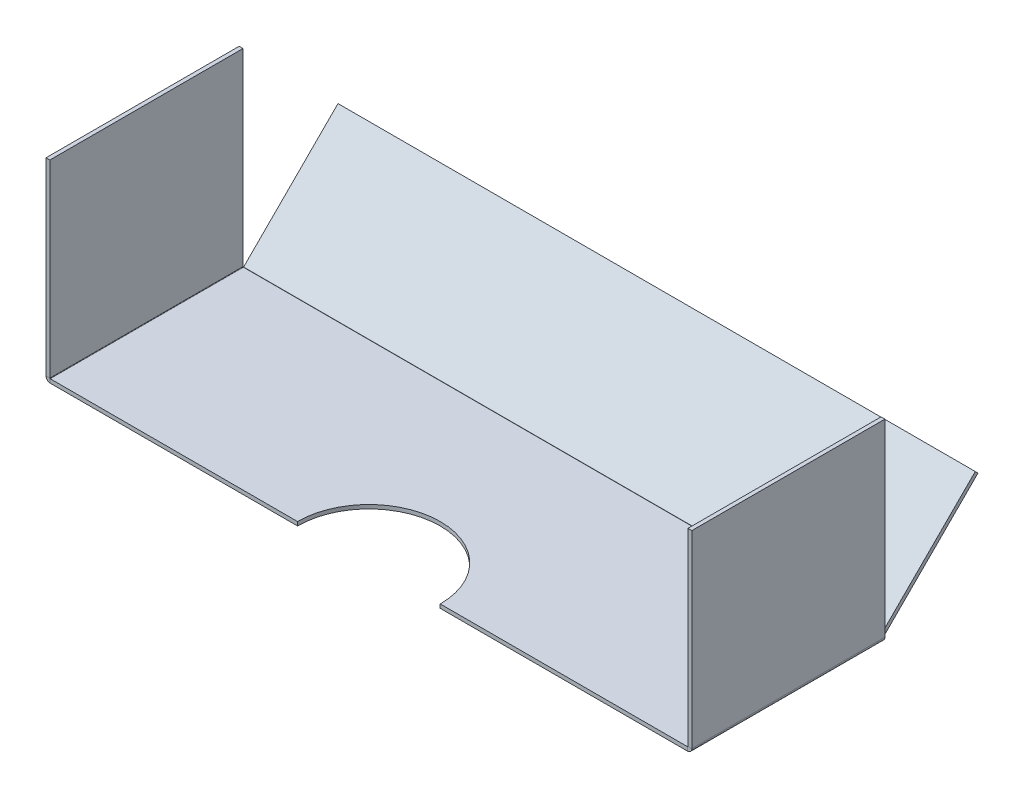
ISO-10303-21;
HEADER;
FILE_DESCRIPTION(('STEP AP214'),'2;1');
FILE_NAME('part.step','',(''),(''),'','','');
FILE_SCHEMA(('AUTOMOTIVE_DESIGN { 1 0 10303 214 1 1 1 1 }'));
ENDSEC;
DATA;
#1=APPLICATION_CONTEXT('core data for automotive mechanical design processes');
#2=APPLICATION_PROTOCOL_DEFINITION('international standard','automotive_design',2000,#1);
#3=PRODUCT_CONTEXT('',#1,'mechanical');
#4=PRODUCT('Part','Part','',(#3));
#5=PRODUCT_RELATED_PRODUCT_CATEGORY('part','',(#4));
#6=PRODUCT_DEFINITION_FORMATION('','',#4);
#7=PRODUCT_DEFINITION_CONTEXT('part definition',#1,'design');
#8=PRODUCT_DEFINITION('design','',#6,#7);
#9=PRODUCT_DEFINITION_SHAPE('','',#8);
#10=(LENGTH_UNIT() NAMED_UNIT(*) SI_UNIT(.MILLI.,.METRE.));
#11=(NAMED_UNIT(*) PLANE_ANGLE_UNIT() SI_UNIT($,.RADIAN.));
#12=(NAMED_UNIT(*) SI_UNIT($,.STERADIAN.) SOLID_ANGLE_UNIT());
#13=UNCERTAINTY_MEASURE_WITH_UNIT(LENGTH_MEASURE(1.E-05),#10,'distance_accuracy_value','');
#14=(GEOMETRIC_REPRESENTATION_CONTEXT(3) GLOBAL_UNCERTAINTY_ASSIGNED_CONTEXT((#13)) GLOBAL_UNIT_ASSIGNED_CONTEXT((#10,
#11,#12)) REPRESENTATION_CONTEXT('',''));
#15=CARTESIAN_POINT('',(0.,0.,0.));
#16=DIRECTION('',(0.,0.,1.));
#17=DIRECTION('',(1.,0.,0.));
#18=AXIS2_PLACEMENT_3D('',#15,#16,#17);
#19=CARTESIAN_POINT('',(-82.5,-1.,25.));
#20=DIRECTION('',(0.,0.,1.));
#21=DIRECTION('',(1.,0.,0.));
#22=AXIS2_PLACEMENT_3D('',#19,#20,#21);
#23=PLANE('',#22);
#24=DIRECTION('',(0.,1.,0.));
#25=VECTOR('',#24,1.);
#26=CARTESIAN_POINT('',(18.4747200460575,-10.,25.));
#27=LINE('',#26,#25);
#28=CARTESIAN_POINT('',(18.4747200460575,-0.999999999999999,25.));
#29=VERTEX_POINT('',#28);
#30=CARTESIAN_POINT('',(18.4747200460575,0.,25.));
#31=VERTEX_POINT('',#30);
#32=EDGE_CURVE('E115',#29,#31,#27,.T.);
#33=ORIENTED_EDGE('',*,*,#32,.F.);
#34=DIRECTION('',(1.,0.,0.));
#35=VECTOR('',#34,1.);
#36=CARTESIAN_POINT('',(-82.5,-1.,25.));
#37=LINE('',#36,#35);
#38=CARTESIAN_POINT('',(82.5,-1.,25.));
#39=VERTEX_POINT('',#38);
#40=EDGE_CURVE('E122',#29,#39,#37,.T.);
#41=ORIENTED_EDGE('',*,*,#40,.T.);
#42=DIRECTION('',(0.,1.,0.));
#43=VECTOR('',#42,1.);
#44=CARTESIAN_POINT('',(82.5,-1.,25.));
#45=LINE('',#44,#43);
#46=CARTESIAN_POINT('',(82.5,0.,25.));
#47=VERTEX_POINT('',#46);
#48=EDGE_CURVE('E13',#39,#47,#45,.T.);
#49=ORIENTED_EDGE('',*,*,#48,.T.);
#50=DIRECTION('',(1.,0.,0.));
#51=VECTOR('',#50,1.);
#52=CARTESIAN_POINT('',(-82.5,0.,25.));
#53=LINE('',#52,#51);
#54=EDGE_CURVE('E152',#31,#47,#53,.T.);
#55=ORIENTED_EDGE('',*,*,#54,.F.);
#56=EDGE_LOOP('',(#33,#41,#49,#55));
#57=FACE_BOUND('',#56,.T.);
#58=ADVANCED_FACE('F98',(#57),#23,.T.);
#59=DIRECTION('',(0.,1.,0.));
#60=VECTOR('',#59,1.);
#61=CARTESIAN_POINT('',(-18.4747200460575,-10.,25.));
#62=LINE('',#61,#60);
#63=CARTESIAN_POINT('',(-18.4747200460575,0.,25.));
#64=VERTEX_POINT('',#63);
#65=CARTESIAN_POINT('',(-18.4747200460575,-0.999999999999999,25.));
#66=VERTEX_POINT('',#65);
#67=EDGE_CURVE('E161',#64,#66,#62,.F.);
#68=ORIENTED_EDGE('',*,*,#67,.F.);
#69=CARTESIAN_POINT('',(-82.5,0.,25.));
#70=VERTEX_POINT('',#69);
#71=EDGE_CURVE('E145',#70,#64,#53,.T.);
#72=ORIENTED_EDGE('',*,*,#71,.F.);
#73=DIRECTION('',(0.,1.,0.));
#74=VECTOR('',#73,1.);
#75=CARTESIAN_POINT('',(-82.5,-1.,25.));
#76=LINE('',#75,#74);
#77=CARTESIAN_POINT('',(-82.5,-1.,25.));
#78=VERTEX_POINT('',#77);
#79=EDGE_CURVE('E107',#78,#70,#76,.T.);
#80=ORIENTED_EDGE('',*,*,#79,.F.);
#81=EDGE_CURVE('E195',#78,#66,#37,.T.);
#82=ORIENTED_EDGE('',*,*,#81,.T.);
#83=EDGE_LOOP('',(#68,#72,#80,#82));
#84=FACE_BOUND('',#83,.T.);
#85=ADVANCED_FACE('F100',(#84),#23,.T.);
#86=CARTESIAN_POINT('',(0.,-1.,0.));
#87=DIRECTION('',(0.,1.,0.));
#88=DIRECTION('',(0.,0.,1.));
#89=AXIS2_PLACEMENT_3D('',#86,#87,#88);
#90=PLANE('',#89);
#91=ORIENTED_EDGE('',*,*,#40,.F.);
#92=CARTESIAN_POINT('',(0.,-0.999999999999999,25.));
#93=DIRECTION('',(0.,1.,0.));
#94=DIRECTION('',(0.,0.,1.));
#95=AXIS2_PLACEMENT_3D('',#92,#93,#94);
#96=CIRCLE('',#95,18.4747200460575);
#97=EDGE_CURVE('E257',#29,#66,#96,.T.);
#98=ORIENTED_EDGE('',*,*,#97,.T.);
#99=ORIENTED_EDGE('',*,*,#81,.F.);
#100=DIRECTION('',(0.,0.,1.));
#101=VECTOR('',#100,1.);
#102=CARTESIAN_POINT('',(-82.5,-1.,-25.));
#103=LINE('',#102,#101);
#104=CARTESIAN_POINT('',(-82.5,-0.999999999999999,-25.));
#105=VERTEX_POINT('',#104);
#106=EDGE_CURVE('E193',#105,#78,#103,.T.);
#107=ORIENTED_EDGE('',*,*,#106,.F.);
#108=DIRECTION('',(-1.,0.,0.));
#109=VECTOR('',#108,1.);
#110=CARTESIAN_POINT('',(-82.5,-1.,-25.));
#111=LINE('',#110,#109);
#112=CARTESIAN_POINT('',(82.5,-1.,-25.));
#113=VERTEX_POINT('',#112);
#114=EDGE_CURVE('E190',#113,#105,#111,.T.);
#115=ORIENTED_EDGE('',*,*,#114,.F.);
#116=DIRECTION('',(0.,0.,-1.));
#117=VECTOR('',#116,1.);
#118=CARTESIAN_POINT('',(82.5,-1.,-25.));
#119=LINE('',#118,#117);
#120=EDGE_CURVE('E162',#39,#113,#119,.T.);
#121=ORIENTED_EDGE('',*,*,#120,.F.);
#122=EDGE_LOOP('',(#91,#98,#99,#107,#115,#121));
#123=FACE_BOUND('',#122,.T.);
#124=ADVANCED_FACE('F476',(#123),#90,.F.);
#125=CARTESIAN_POINT('',(0.,0.,0.));
#126=DIRECTION('',(0.,1.,0.));
#127=DIRECTION('',(0.,0.,1.));
#128=AXIS2_PLACEMENT_3D('',#125,#126,#127);
#129=PLANE('',#128);
#130=CARTESIAN_POINT('',(0.,0.,25.));
#131=DIRECTION('',(0.,1.,0.));
#132=DIRECTION('',(0.,0.,1.));
#133=AXIS2_PLACEMENT_3D('',#130,#131,#132);
#134=CIRCLE('',#133,18.4747200460575);
#135=EDGE_CURVE('E255',#31,#64,#134,.T.);
#136=ORIENTED_EDGE('',*,*,#135,.F.);
#137=ORIENTED_EDGE('',*,*,#54,.T.);
#138=DIRECTION('',(0.,0.,-1.));
#139=VECTOR('',#138,1.);
#140=CARTESIAN_POINT('',(82.5,0.,-25.));
#141=LINE('',#140,#139);
#142=CARTESIAN_POINT('',(82.5,0.,-25.));
#143=VERTEX_POINT('',#142);
#144=EDGE_CURVE('E197',#47,#143,#141,.T.);
#145=ORIENTED_EDGE('',*,*,#144,.T.);
#146=DIRECTION('',(-1.,0.,0.));
#147=VECTOR('',#146,1.);
#148=CARTESIAN_POINT('',(-82.5,0.,-25.));
#149=LINE('',#148,#147);
#150=CARTESIAN_POINT('',(-82.5,0.,-25.));
#151=VERTEX_POINT('',#150);
#152=EDGE_CURVE('E147',#143,#151,#149,.T.);
#153=ORIENTED_EDGE('',*,*,#152,.T.);
#154=DIRECTION('',(0.,0.,1.));
#155=VECTOR('',#154,1.);
#156=CARTESIAN_POINT('',(-82.5,0.,-25.));
#157=LINE('',#156,#155);
#158=EDGE_CURVE('E141',#151,#70,#157,.T.);
#159=ORIENTED_EDGE('',*,*,#158,.T.);
#160=ORIENTED_EDGE('',*,*,#71,.T.);
#161=EDGE_LOOP('',(#136,#137,#145,#153,#159,#160));
#162=FACE_BOUND('',#161,.T.);
#163=ADVANCED_FACE('F143',(#162),#129,.T.);
#164=CARTESIAN_POINT('',(-82.5,0.100000000000003,-25.));
#165=DIRECTION('',(0.,0.,-1.));
#166=DIRECTION('',(-1.,0.,0.));
#167=AXIS2_PLACEMENT_3D('',#164,#165,#166);
#168=PLANE('',#167);
#169=DIRECTION('',(1.,0.,0.));
#170=VECTOR('',#169,1.);
#171=CARTESIAN_POINT('',(-83.6,0.0999999999999995,-25.));
#172=LINE('',#171,#170);
#173=CARTESIAN_POINT('',(-82.6,0.100000000000003,-25.));
#174=VERTEX_POINT('',#173);
#175=CARTESIAN_POINT('',(-83.6,0.0999999999999995,-25.));
#176=VERTEX_POINT('',#175);
#177=EDGE_CURVE('E297',#174,#176,#172,.F.);
#178=ORIENTED_EDGE('',*,*,#177,.F.);
#179=CARTESIAN_POINT('',(-82.5,0.100000000000003,-25.));
#180=DIRECTION('',(0.,0.,1.));
#181=DIRECTION('',(1.,0.,0.));
#182=AXIS2_PLACEMENT_3D('',#179,#180,#181);
#183=CIRCLE('',#182,0.100000000000003);
#184=EDGE_CURVE('E179',#151,#174,#183,.F.);
#185=ORIENTED_EDGE('',*,*,#184,.F.);
#186=DIRECTION('',(0.,1.,0.));
#187=VECTOR('',#186,1.);
#188=CARTESIAN_POINT('',(-82.5,-1.,-25.));
#189=LINE('',#188,#187);
#190=EDGE_CURVE('E173',#105,#151,#189,.T.);
#191=ORIENTED_EDGE('',*,*,#190,.F.);
#192=CARTESIAN_POINT('',(-82.5,0.100000000000003,-25.));
#193=DIRECTION('',(0.,0.,1.));
#194=DIRECTION('',(1.,0.,0.));
#195=AXIS2_PLACEMENT_3D('',#192,#193,#194);
#196=CIRCLE('',#195,1.1);
#197=EDGE_CURVE('E199',#105,#176,#196,.F.);
#198=ORIENTED_EDGE('',*,*,#197,.T.);
#199=EDGE_LOOP('',(#178,#185,#191,#198));
#200=FACE_BOUND('',#199,.T.);
#201=ADVANCED_FACE('F333',(#200),#168,.T.);
#202=CARTESIAN_POINT('',(-82.5,0.100000000000003,25.));
#203=DIRECTION('',(0.,0.,-1.));
#204=DIRECTION('',(-1.,0.,0.));
#205=AXIS2_PLACEMENT_3D('',#202,#203,#204);
#206=PLANE('',#205);
#207=CARTESIAN_POINT('',(-82.5,0.100000000000003,25.));
#208=DIRECTION('',(0.,0.,1.));
#209=DIRECTION('',(1.,0.,0.));
#210=AXIS2_PLACEMENT_3D('',#207,#208,#209);
#211=CIRCLE('',#210,0.100000000000003);
#212=CARTESIAN_POINT('',(-82.6,0.100000000000003,25.));
#213=VERTEX_POINT('',#212);
#214=EDGE_CURVE('E169',#213,#70,#211,.T.);
#215=ORIENTED_EDGE('',*,*,#214,.F.);
#216=DIRECTION('',(1.,0.,0.));
#217=VECTOR('',#216,1.);
#218=CARTESIAN_POINT('',(-82.6,0.100000000000003,25.));
#219=LINE('',#218,#217);
#220=CARTESIAN_POINT('',(-83.6,0.0999999999999995,25.));
#221=VERTEX_POINT('',#220);
#222=EDGE_CURVE('E323',#213,#221,#219,.F.);
#223=ORIENTED_EDGE('',*,*,#222,.T.);
#224=CARTESIAN_POINT('',(-82.5,0.100000000000003,25.));
#225=DIRECTION('',(0.,0.,1.));
#226=DIRECTION('',(1.,0.,0.));
#227=AXIS2_PLACEMENT_3D('',#224,#225,#226);
#228=CIRCLE('',#227,1.1);
#229=EDGE_CURVE('E172',#221,#78,#228,.T.);
#230=ORIENTED_EDGE('',*,*,#229,.T.);
#231=ORIENTED_EDGE('',*,*,#79,.T.);
#232=EDGE_LOOP('',(#215,#223,#230,#231));
#233=FACE_BOUND('',#232,.T.);
#234=ADVANCED_FACE('F167',(#233),#206,.F.);
#235=CARTESIAN_POINT('',(-82.5,0.100000000000003,25.));
#236=DIRECTION('',(0.,0.,1.));
#237=DIRECTION('',(-1.,0.,0.));
#238=AXIS2_PLACEMENT_3D('',#235,#236,#237);
#239=CYLINDRICAL_SURFACE('',#238,1.1);
#240=ORIENTED_EDGE('',*,*,#106,.T.);
#241=ORIENTED_EDGE('',*,*,#229,.F.);
#242=DIRECTION('',(0.,0.,1.));
#243=VECTOR('',#242,1.);
#244=CARTESIAN_POINT('',(-83.6,0.0999999999999995,-25.));
#245=LINE('',#244,#243);
#246=EDGE_CURVE('E320',#221,#176,#245,.F.);
#247=ORIENTED_EDGE('',*,*,#246,.T.);
#248=ORIENTED_EDGE('',*,*,#197,.F.);
#249=EDGE_LOOP('',(#240,#241,#247,#248));
#250=FACE_BOUND('',#249,.T.);
#251=ADVANCED_FACE('F538',(#250),#239,.T.);
#252=CARTESIAN_POINT('',(-82.5,0.100000000000003,25.));
#253=DIRECTION('',(0.,0.,1.));
#254=DIRECTION('',(-1.,0.,0.));
#255=AXIS2_PLACEMENT_3D('',#252,#253,#254);
#256=CYLINDRICAL_SURFACE('',#255,0.100000000000003);
#257=ORIENTED_EDGE('',*,*,#158,.F.);
#258=ORIENTED_EDGE('',*,*,#184,.T.);
#259=DIRECTION('',(0.,0.,1.));
#260=VECTOR('',#259,1.);
#261=CARTESIAN_POINT('',(-82.6,0.100000000000003,-25.));
#262=LINE('',#261,#260);
#263=EDGE_CURVE('E178',#174,#213,#262,.T.);
#264=ORIENTED_EDGE('',*,*,#263,.T.);
#265=ORIENTED_EDGE('',*,*,#214,.T.);
#266=EDGE_LOOP('',(#257,#258,#264,#265));
#267=FACE_BOUND('',#266,.T.);
#268=ADVANCED_FACE('F176',(#267),#256,.F.);
#269=CARTESIAN_POINT('',(-83.6,0.,-25.));
#270=DIRECTION('',(0.,0.,1.));
#271=DIRECTION('',(1.,0.,0.));
#272=AXIS2_PLACEMENT_3D('',#269,#270,#271);
#273=PLANE('',#272);
#274=ORIENTED_EDGE('',*,*,#177,.T.);
#275=DIRECTION('',(0.,-1.,0.));
#276=VECTOR('',#275,1.);
#277=CARTESIAN_POINT('',(-83.6,-2.83879439088564E-13,-25.));
#278=LINE('',#277,#276);
#279=CARTESIAN_POINT('',(-83.6000000000002,49.,-25.));
#280=VERTEX_POINT('',#279);
#281=EDGE_CURVE('E308',#280,#176,#278,.T.);
#282=ORIENTED_EDGE('',*,*,#281,.F.);
#283=DIRECTION('',(1.,0.,0.));
#284=VECTOR('',#283,1.);
#285=CARTESIAN_POINT('',(-83.6000000000002,49.,-25.));
#286=LINE('',#285,#284);
#287=CARTESIAN_POINT('',(-82.6000000000002,49.,-25.));
#288=VERTEX_POINT('',#287);
#289=EDGE_CURVE('E184',#280,#288,#286,.T.);
#290=ORIENTED_EDGE('',*,*,#289,.T.);
#291=DIRECTION('',(0.,1.,0.));
#292=VECTOR('',#291,1.);
#293=CARTESIAN_POINT('',(-82.6,0.,-25.));
#294=LINE('',#293,#292);
#295=EDGE_CURVE('E317',#288,#174,#294,.F.);
#296=ORIENTED_EDGE('',*,*,#295,.T.);
#297=EDGE_LOOP('',(#274,#282,#290,#296));
#298=FACE_BOUND('',#297,.T.);
#299=ADVANCED_FACE('F341',(#298),#273,.F.);
#300=CARTESIAN_POINT('',(-83.6000000000002,49.,25.));
#301=DIRECTION('',(0.,0.,-1.));
#302=DIRECTION('',(-1.,0.,0.));
#303=AXIS2_PLACEMENT_3D('',#300,#301,#302);
#304=PLANE('',#303);
#305=ORIENTED_EDGE('',*,*,#222,.F.);
#306=DIRECTION('',(0.,-1.,0.));
#307=VECTOR('',#306,1.);
#308=CARTESIAN_POINT('',(-82.6000000000002,49.,25.));
#309=LINE('',#308,#307);
#310=CARTESIAN_POINT('',(-82.6000000000002,49.,25.));
#311=VERTEX_POINT('',#310);
#312=EDGE_CURVE('E314',#213,#311,#309,.F.);
#313=ORIENTED_EDGE('',*,*,#312,.T.);
#314=DIRECTION('',(1.,0.,0.));
#315=VECTOR('',#314,1.);
#316=CARTESIAN_POINT('',(-83.6000000000002,49.,25.));
#317=LINE('',#316,#315);
#318=CARTESIAN_POINT('',(-83.6000000000002,49.,25.));
#319=VERTEX_POINT('',#318);
#320=EDGE_CURVE('E180',#319,#311,#317,.T.);
#321=ORIENTED_EDGE('',*,*,#320,.F.);
#322=DIRECTION('',(0.,1.,0.));
#323=VECTOR('',#322,1.);
#324=CARTESIAN_POINT('',(-83.6,-2.83879439088564E-13,25.));
#325=LINE('',#324,#323);
#326=EDGE_CURVE('E305',#221,#319,#325,.T.);
#327=ORIENTED_EDGE('',*,*,#326,.F.);
#328=EDGE_LOOP('',(#305,#313,#321,#327));
#329=FACE_BOUND('',#328,.T.);
#330=ADVANCED_FACE('F528',(#329),#304,.F.);
#331=CARTESIAN_POINT('',(-83.6,-2.83879439088564E-13,0.));
#332=DIRECTION('',(1.,0.,0.));
#333=DIRECTION('',(0.,1.,0.));
#334=AXIS2_PLACEMENT_3D('',#331,#332,#333);
#335=PLANE('',#334);
#336=ORIENTED_EDGE('',*,*,#246,.F.);
#337=ORIENTED_EDGE('',*,*,#326,.T.);
#338=DIRECTION('',(0.,0.,-1.));
#339=VECTOR('',#338,1.);
#340=CARTESIAN_POINT('',(-83.6000000000002,49.,0.));
#341=LINE('',#340,#339);
#342=EDGE_CURVE('E302',#319,#280,#341,.T.);
#343=ORIENTED_EDGE('',*,*,#342,.T.);
#344=ORIENTED_EDGE('',*,*,#281,.T.);
#345=EDGE_LOOP('',(#336,#337,#343,#344));
#346=FACE_BOUND('',#345,.T.);
#347=ADVANCED_FACE('F346',(#346),#335,.F.);
#348=CARTESIAN_POINT('',(-82.6,-2.80387957749721E-13,0.));
#349=DIRECTION('',(1.,0.,0.));
#350=DIRECTION('',(0.,1.,0.));
#351=AXIS2_PLACEMENT_3D('',#348,#349,#350);
#352=PLANE('',#351);
#353=ORIENTED_EDGE('',*,*,#312,.F.);
#354=ORIENTED_EDGE('',*,*,#263,.F.);
#355=ORIENTED_EDGE('',*,*,#295,.F.);
#356=DIRECTION('',(0.,0.,1.));
#357=VECTOR('',#356,1.);
#358=CARTESIAN_POINT('',(-82.6000000000002,49.,-25.));
#359=LINE('',#358,#357);
#360=EDGE_CURVE('E311',#311,#288,#359,.F.);
#361=ORIENTED_EDGE('',*,*,#360,.F.);
#362=EDGE_LOOP('',(#353,#354,#355,#361));
#363=FACE_BOUND('',#362,.T.);
#364=ADVANCED_FACE('F362',(#363),#352,.T.);
#365=CARTESIAN_POINT('',(-83.6000000000002,49.,-25.));
#366=DIRECTION('',(0.,-1.,0.));
#367=DIRECTION('',(1.,0.,0.));
#368=AXIS2_PLACEMENT_3D('',#365,#366,#367);
#369=PLANE('',#368);
#370=ORIENTED_EDGE('',*,*,#360,.T.);
#371=ORIENTED_EDGE('',*,*,#289,.F.);
#372=ORIENTED_EDGE('',*,*,#342,.F.);
#373=ORIENTED_EDGE('',*,*,#320,.T.);
#374=EDGE_LOOP('',(#370,#371,#372,#373));
#375=FACE_BOUND('',#374,.T.);
#376=ADVANCED_FACE('F355',(#375),#369,.F.);
#377=CARTESIAN_POINT('',(82.5,0.100000000000003,25.));
#378=DIRECTION('',(0.,0.,1.));
#379=DIRECTION('',(1.,0.,0.));
#380=AXIS2_PLACEMENT_3D('',#377,#378,#379);
#381=PLANE('',#380);
#382=DIRECTION('',(1.,0.,0.));
#383=VECTOR('',#382,1.);
#384=CARTESIAN_POINT('',(83.6,0.100000000000003,25.));
#385=LINE('',#384,#383);
#386=CARTESIAN_POINT('',(82.6,0.100000000000003,25.));
#387=VERTEX_POINT('',#386);
#388=CARTESIAN_POINT('',(83.6,0.0999999999999995,25.));
#389=VERTEX_POINT('',#388);
#390=EDGE_CURVE('E262',#387,#389,#385,.T.);
#391=ORIENTED_EDGE('',*,*,#390,.F.);
#392=CARTESIAN_POINT('',(82.5,0.100000000000003,25.));
#393=DIRECTION('',(0.,0.,-1.));
#394=DIRECTION('',(-1.,0.,0.));
#395=AXIS2_PLACEMENT_3D('',#392,#393,#394);
#396=CIRCLE('',#395,0.100000000000003);
#397=EDGE_CURVE('E232',#47,#387,#396,.F.);
#398=ORIENTED_EDGE('',*,*,#397,.F.);
#399=ORIENTED_EDGE('',*,*,#48,.F.);
#400=CARTESIAN_POINT('',(82.5,0.100000000000003,25.));
#401=DIRECTION('',(0.,0.,-1.));
#402=DIRECTION('',(-1.,0.,0.));
#403=AXIS2_PLACEMENT_3D('',#400,#401,#402);
#404=CIRCLE('',#403,1.1);
#405=EDGE_CURVE('E294',#39,#389,#404,.F.);
#406=ORIENTED_EDGE('',*,*,#405,.T.);
#407=EDGE_LOOP('',(#391,#398,#399,#406));
#408=FACE_BOUND('',#407,.T.);
#409=ADVANCED_FACE('F483',(#408),#381,.T.);
#410=CARTESIAN_POINT('',(82.5,0.100000000000003,-25.));
#411=DIRECTION('',(0.,0.,1.));
#412=DIRECTION('',(1.,0.,0.));
#413=AXIS2_PLACEMENT_3D('',#410,#411,#412);
#414=PLANE('',#413);
#415=CARTESIAN_POINT('',(82.5,0.100000000000003,-25.));
#416=DIRECTION('',(0.,0.,-1.));
#417=DIRECTION('',(-1.,0.,0.));
#418=AXIS2_PLACEMENT_3D('',#415,#416,#417);
#419=CIRCLE('',#418,0.100000000000003);
#420=CARTESIAN_POINT('',(82.6,0.100000000000003,-25.));
#421=VERTEX_POINT('',#420);
#422=EDGE_CURVE('E215',#421,#143,#419,.T.);
#423=ORIENTED_EDGE('',*,*,#422,.F.);
#424=DIRECTION('',(1.,0.,0.));
#425=VECTOR('',#424,1.);
#426=CARTESIAN_POINT('',(82.6,0.100000000000003,-25.));
#427=LINE('',#426,#425);
#428=CARTESIAN_POINT('',(83.6,0.0999999999999995,-25.));
#429=VERTEX_POINT('',#428);
#430=EDGE_CURVE('E289',#421,#429,#427,.T.);
#431=ORIENTED_EDGE('',*,*,#430,.T.);
#432=CARTESIAN_POINT('',(82.5,0.100000000000003,-25.));
#433=DIRECTION('',(0.,0.,-1.));
#434=DIRECTION('',(-1.,0.,0.));
#435=AXIS2_PLACEMENT_3D('',#432,#433,#434);
#436=CIRCLE('',#435,1.1);
#437=EDGE_CURVE('E219',#429,#113,#436,.T.);
#438=ORIENTED_EDGE('',*,*,#437,.T.);
#439=DIRECTION('',(0.,1.,0.));
#440=VECTOR('',#439,1.);
#441=CARTESIAN_POINT('',(82.5,-1.,-25.));
#442=LINE('',#441,#440);
#443=EDGE_CURVE('E102',#113,#143,#442,.T.);
#444=ORIENTED_EDGE('',*,*,#443,.T.);
#445=EDGE_LOOP('',(#423,#431,#438,#444));
#446=FACE_BOUND('',#445,.T.);
#447=ADVANCED_FACE('F212',(#446),#414,.F.);
#448=CARTESIAN_POINT('',(82.5,0.100000000000003,-25.));
#449=DIRECTION('',(0.,0.,-1.));
#450=DIRECTION('',(1.,0.,0.));
#451=AXIS2_PLACEMENT_3D('',#448,#449,#450);
#452=CYLINDRICAL_SURFACE('',#451,1.1);
#453=ORIENTED_EDGE('',*,*,#120,.T.);
#454=ORIENTED_EDGE('',*,*,#437,.F.);
#455=DIRECTION('',(0.,0.,-1.));
#456=VECTOR('',#455,1.);
#457=CARTESIAN_POINT('',(83.6,0.0999999999999995,25.));
#458=LINE('',#457,#456);
#459=EDGE_CURVE('E286',#429,#389,#458,.F.);
#460=ORIENTED_EDGE('',*,*,#459,.T.);
#461=ORIENTED_EDGE('',*,*,#405,.F.);
#462=EDGE_LOOP('',(#453,#454,#460,#461));
#463=FACE_BOUND('',#462,.T.);
#464=ADVANCED_FACE('F484',(#463),#452,.T.);
#465=CARTESIAN_POINT('',(82.5,0.100000000000003,-25.));
#466=DIRECTION('',(0.,0.,-1.));
#467=DIRECTION('',(1.,0.,0.));
#468=AXIS2_PLACEMENT_3D('',#465,#466,#467);
#469=CYLINDRICAL_SURFACE('',#468,0.100000000000003);
#470=ORIENTED_EDGE('',*,*,#144,.F.);
#471=ORIENTED_EDGE('',*,*,#397,.T.);
#472=DIRECTION('',(0.,0.,-1.));
#473=VECTOR('',#472,1.);
#474=CARTESIAN_POINT('',(82.6,0.100000000000003,25.));
#475=LINE('',#474,#473);
#476=EDGE_CURVE('E231',#387,#421,#475,.T.);
#477=ORIENTED_EDGE('',*,*,#476,.T.);
#478=ORIENTED_EDGE('',*,*,#422,.T.);
#479=EDGE_LOOP('',(#470,#471,#477,#478));
#480=FACE_BOUND('',#479,.T.);
#481=ADVANCED_FACE('F227',(#480),#469,.F.);
#482=CARTESIAN_POINT('',(83.6,0.,-25.));
#483=DIRECTION('',(0.,0.,-1.));
#484=DIRECTION('',(-1.,0.,0.));
#485=AXIS2_PLACEMENT_3D('',#482,#483,#484);
#486=PLANE('',#485);
#487=DIRECTION('',(0.,1.,0.));
#488=VECTOR('',#487,1.);
#489=CARTESIAN_POINT('',(83.6,0.,-25.));
#490=LINE('',#489,#488);
#491=CARTESIAN_POINT('',(83.6000000000002,49.,-25.));
#492=VERTEX_POINT('',#491);
#493=EDGE_CURVE('E274',#492,#429,#490,.F.);
#494=ORIENTED_EDGE('',*,*,#493,.T.);
#495=ORIENTED_EDGE('',*,*,#430,.F.);
#496=DIRECTION('',(0.,-1.,0.));
#497=VECTOR('',#496,1.);
#498=CARTESIAN_POINT('',(82.6,-2.80387957749721E-13,-25.));
#499=LINE('',#498,#497);
#500=CARTESIAN_POINT('',(82.6000000000002,49.,-25.));
#501=VERTEX_POINT('',#500);
#502=EDGE_CURVE('E283',#501,#421,#499,.T.);
#503=ORIENTED_EDGE('',*,*,#502,.F.);
#504=DIRECTION('',(-1.,0.,0.));
#505=VECTOR('',#504,1.);
#506=CARTESIAN_POINT('',(83.6000000000002,49.,-25.));
#507=LINE('',#506,#505);
#508=EDGE_CURVE('E233',#492,#501,#507,.T.);
#509=ORIENTED_EDGE('',*,*,#508,.F.);
#510=EDGE_LOOP('',(#494,#495,#503,#509));
#511=FACE_BOUND('',#510,.T.);
#512=ADVANCED_FACE('F492',(#511),#486,.T.);
#513=CARTESIAN_POINT('',(83.6000000000002,49.,25.));
#514=DIRECTION('',(0.,0.,1.));
#515=DIRECTION('',(1.,0.,0.));
#516=AXIS2_PLACEMENT_3D('',#513,#514,#515);
#517=PLANE('',#516);
#518=DIRECTION('',(0.,1.,0.));
#519=VECTOR('',#518,1.);
#520=CARTESIAN_POINT('',(82.6,-2.80387957749721E-13,25.));
#521=LINE('',#520,#519);
#522=CARTESIAN_POINT('',(82.6000000000002,49.,25.));
#523=VERTEX_POINT('',#522);
#524=EDGE_CURVE('E277',#387,#523,#521,.T.);
#525=ORIENTED_EDGE('',*,*,#524,.F.);
#526=ORIENTED_EDGE('',*,*,#390,.T.);
#527=DIRECTION('',(0.,-1.,0.));
#528=VECTOR('',#527,1.);
#529=CARTESIAN_POINT('',(83.6000000000002,49.,25.));
#530=LINE('',#529,#528);
#531=CARTESIAN_POINT('',(83.6000000000002,49.,25.));
#532=VERTEX_POINT('',#531);
#533=EDGE_CURVE('E268',#389,#532,#530,.F.);
#534=ORIENTED_EDGE('',*,*,#533,.T.);
#535=DIRECTION('',(-1.,0.,0.));
#536=VECTOR('',#535,1.);
#537=CARTESIAN_POINT('',(83.6000000000002,49.,25.));
#538=LINE('',#537,#536);
#539=EDGE_CURVE('E265',#532,#523,#538,.T.);
#540=ORIENTED_EDGE('',*,*,#539,.T.);
#541=EDGE_LOOP('',(#525,#526,#534,#540));
#542=FACE_BOUND('',#541,.T.);
#543=ADVANCED_FACE('F500',(#542),#517,.T.);
#544=CARTESIAN_POINT('',(83.6,-2.83879439088564E-13,0.));
#545=DIRECTION('',(-1.,0.,0.));
#546=DIRECTION('',(0.,1.,0.));
#547=AXIS2_PLACEMENT_3D('',#544,#545,#546);
#548=PLANE('',#547);
#549=ORIENTED_EDGE('',*,*,#459,.F.);
#550=ORIENTED_EDGE('',*,*,#493,.F.);
#551=DIRECTION('',(0.,0.,1.));
#552=VECTOR('',#551,1.);
#553=CARTESIAN_POINT('',(83.6000000000002,49.,-25.));
#554=LINE('',#553,#552);
#555=EDGE_CURVE('E271',#532,#492,#554,.F.);
#556=ORIENTED_EDGE('',*,*,#555,.F.);
#557=ORIENTED_EDGE('',*,*,#533,.F.);
#558=EDGE_LOOP('',(#549,#550,#556,#557));
#559=FACE_BOUND('',#558,.T.);
#560=ADVANCED_FACE('F489',(#559),#548,.F.);
#561=CARTESIAN_POINT('',(82.6,-2.80387957749721E-13,0.));
#562=DIRECTION('',(-1.,0.,0.));
#563=DIRECTION('',(0.,1.,0.));
#564=AXIS2_PLACEMENT_3D('',#561,#562,#563);
#565=PLANE('',#564);
#566=ORIENTED_EDGE('',*,*,#502,.T.);
#567=ORIENTED_EDGE('',*,*,#476,.F.);
#568=ORIENTED_EDGE('',*,*,#524,.T.);
#569=DIRECTION('',(0.,0.,-1.));
#570=VECTOR('',#569,1.);
#571=CARTESIAN_POINT('',(82.6000000000002,49.,0.));
#572=LINE('',#571,#570);
#573=EDGE_CURVE('E280',#523,#501,#572,.T.);
#574=ORIENTED_EDGE('',*,*,#573,.T.);
#575=EDGE_LOOP('',(#566,#567,#568,#574));
#576=FACE_BOUND('',#575,.T.);
#577=ADVANCED_FACE('F502',(#576),#565,.T.);
#578=CARTESIAN_POINT('',(83.6000000000002,49.,-25.));
#579=DIRECTION('',(0.,1.,0.));
#580=DIRECTION('',(-1.,0.,0.));
#581=AXIS2_PLACEMENT_3D('',#578,#579,#580);
#582=PLANE('',#581);
#583=ORIENTED_EDGE('',*,*,#573,.F.);
#584=ORIENTED_EDGE('',*,*,#539,.F.);
#585=ORIENTED_EDGE('',*,*,#555,.T.);
#586=ORIENTED_EDGE('',*,*,#508,.T.);
#587=EDGE_LOOP('',(#583,#584,#585,#586));
#588=FACE_BOUND('',#587,.T.);
#589=ADVANCED_FACE('F496',(#588),#582,.T.);
#590=CARTESIAN_POINT('',(0.,-10.,25.));
#591=DIRECTION('',(0.,1.,0.));
#592=DIRECTION('',(0.,0.,1.));
#593=AXIS2_PLACEMENT_3D('',#590,#591,#592);
#594=CYLINDRICAL_SURFACE('',#593,18.4747200460575);
#595=ORIENTED_EDGE('',*,*,#32,.T.);
#596=ORIENTED_EDGE('',*,*,#135,.T.);
#597=ORIENTED_EDGE('',*,*,#67,.T.);
#598=ORIENTED_EDGE('',*,*,#97,.F.);
#599=EDGE_LOOP('',(#595,#596,#597,#598));
#600=FACE_BOUND('',#599,.T.);
#601=ADVANCED_FACE('F509',(#600),#594,.F.);
#602=CARTESIAN_POINT('',(82.5,0.100000000000013,-25.));
#603=DIRECTION('',(1.,0.,0.));
#604=DIRECTION('',(0.,0.,-1.));
#605=AXIS2_PLACEMENT_3D('',#602,#603,#604);
#606=PLANE('',#605);
#607=DIRECTION('',(0.,-0.707106781186551,-0.707106781186544));
#608=VECTOR('',#607,1.);
#609=CARTESIAN_POINT('',(82.5,-0.677817459305216,-25.7778174593052));
#610=LINE('',#609,#608);
#611=CARTESIAN_POINT('',(82.5,0.0292893218813498,-25.0707106781187));
#612=VERTEX_POINT('',#611);
#613=CARTESIAN_POINT('',(82.5,-0.677817459305198,-25.7778174593052));
#614=VERTEX_POINT('',#613);
#615=EDGE_CURVE('E246',#612,#614,#610,.T.);
#616=ORIENTED_EDGE('',*,*,#615,.F.);
#617=CARTESIAN_POINT('',(82.5,0.100000000000013,-25.));
#618=DIRECTION('',(-1.,0.,0.));
#619=DIRECTION('',(0.,0.,1.));
#620=AXIS2_PLACEMENT_3D('',#617,#618,#619);
#621=CIRCLE('',#620,0.100000000000012);
#622=EDGE_CURVE('E240',#143,#612,#621,.F.);
#623=ORIENTED_EDGE('',*,*,#622,.F.);
#624=ORIENTED_EDGE('',*,*,#443,.F.);
#625=CARTESIAN_POINT('',(82.5,0.100000000000013,-25.));
#626=DIRECTION('',(-1.,0.,0.));
#627=DIRECTION('',(0.,0.,1.));
#628=AXIS2_PLACEMENT_3D('',#625,#626,#627);
#629=CIRCLE('',#628,1.10000000000001);
#630=EDGE_CURVE('E249',#113,#614,#629,.F.);
#631=ORIENTED_EDGE('',*,*,#630,.T.);
#632=EDGE_LOOP('',(#616,#623,#624,#631));
#633=FACE_BOUND('',#632,.T.);
#634=ADVANCED_FACE('F244',(#633),#606,.T.);
#635=CARTESIAN_POINT('',(-82.5,0.100000000000013,-25.));
#636=DIRECTION('',(1.,0.,0.));
#637=DIRECTION('',(0.,0.,-1.));
#638=AXIS2_PLACEMENT_3D('',#635,#636,#637);
#639=PLANE('',#638);
#640=CARTESIAN_POINT('',(-82.5,0.100000000000013,-25.));
#641=DIRECTION('',(-1.,0.,0.));
#642=DIRECTION('',(0.,0.,1.));
#643=AXIS2_PLACEMENT_3D('',#640,#641,#642);
#644=CIRCLE('',#643,0.100000000000012);
#645=CARTESIAN_POINT('',(-82.5,0.0292893218813498,-25.0707106781187));
#646=VERTEX_POINT('',#645);
#647=EDGE_CURVE('E242',#646,#151,#644,.T.);
#648=ORIENTED_EDGE('',*,*,#647,.F.);
#649=DIRECTION('',(0.,-0.707106781186551,-0.707106781186544));
#650=VECTOR('',#649,1.);
#651=CARTESIAN_POINT('',(-82.5,0.0292893218813498,-25.0707106781187));
#652=LINE('',#651,#650);
#653=CARTESIAN_POINT('',(-82.5,-0.6778174593052,-25.7778174593052));
#654=VERTEX_POINT('',#653);
#655=EDGE_CURVE('E420',#646,#654,#652,.T.);
#656=ORIENTED_EDGE('',*,*,#655,.T.);
#657=CARTESIAN_POINT('',(-82.5,0.100000000000013,-25.));
#658=DIRECTION('',(-1.,0.,0.));
#659=DIRECTION('',(0.,0.,1.));
#660=AXIS2_PLACEMENT_3D('',#657,#658,#659);
#661=CIRCLE('',#660,1.10000000000001);
#662=EDGE_CURVE('E247',#654,#105,#661,.T.);
#663=ORIENTED_EDGE('',*,*,#662,.T.);
#664=ORIENTED_EDGE('',*,*,#190,.T.);
#665=EDGE_LOOP('',(#648,#656,#663,#664));
#666=FACE_BOUND('',#665,.T.);
#667=ADVANCED_FACE('F421',(#666),#639,.F.);
#668=CARTESIAN_POINT('',(-82.5,0.100000000000013,-25.));
#669=DIRECTION('',(-1.,0.,0.));
#670=DIRECTION('',(0.,-0.707106781186551,-0.707106781186544));
#671=AXIS2_PLACEMENT_3D('',#668,#669,#670);
#672=CYLINDRICAL_SURFACE('',#671,1.10000000000001);
#673=ORIENTED_EDGE('',*,*,#114,.T.);
#674=ORIENTED_EDGE('',*,*,#662,.F.);
#675=DIRECTION('',(-1.,0.,0.));
#676=VECTOR('',#675,1.);
#677=CARTESIAN_POINT('',(0.,-0.677817459305202,-25.7778174593052));
#678=LINE('',#677,#676);
#679=EDGE_CURVE('E418',#614,#654,#678,.T.);
#680=ORIENTED_EDGE('',*,*,#679,.F.);
#681=ORIENTED_EDGE('',*,*,#630,.F.);
#682=EDGE_LOOP('',(#673,#674,#680,#681));
#683=FACE_BOUND('',#682,.T.);
#684=ADVANCED_FACE('F416',(#683),#672,.T.);
#685=CARTESIAN_POINT('',(-82.5,0.100000000000013,-25.));
#686=DIRECTION('',(-1.,0.,0.));
#687=DIRECTION('',(0.,-0.707106781186551,-0.707106781186544));
#688=AXIS2_PLACEMENT_3D('',#685,#686,#687);
#689=CYLINDRICAL_SURFACE('',#688,0.100000000000012);
#690=ORIENTED_EDGE('',*,*,#152,.F.);
#691=ORIENTED_EDGE('',*,*,#622,.T.);
#692=DIRECTION('',(1.,0.,0.));
#693=VECTOR('',#692,1.);
#694=CARTESIAN_POINT('',(82.5,0.0292893218813475,-25.0707106781187));
#695=LINE('',#694,#693);
#696=EDGE_CURVE('E426',#612,#646,#695,.F.);
#697=ORIENTED_EDGE('',*,*,#696,.T.);
#698=ORIENTED_EDGE('',*,*,#647,.T.);
#699=EDGE_LOOP('',(#690,#691,#697,#698));
#700=FACE_BOUND('',#699,.T.);
#701=ADVANCED_FACE('F237',(#700),#689,.F.);
#702=CARTESIAN_POINT('',(-82.5,-0.707106781186549,-25.7485281374239));
#703=DIRECTION('',(-1.,0.,0.));
#704=DIRECTION('',(0.,0.,1.));
#705=AXIS2_PLACEMENT_3D('',#702,#703,#704);
#706=PLANE('',#705);
#707=DIRECTION('',(0.,-0.707106781186544,0.707106781186551));
#708=VECTOR('',#707,1.);
#709=CARTESIAN_POINT('',(-82.5,-0.707106781186549,-25.7485281374239));
#710=LINE('',#709,#708);
#711=CARTESIAN_POINT('',(-82.5,23.748737341529,-50.2043722601397));
#712=VERTEX_POINT('',#711);
#713=EDGE_CURVE('E433',#712,#654,#710,.T.);
#714=ORIENTED_EDGE('',*,*,#713,.T.);
#715=ORIENTED_EDGE('',*,*,#655,.F.);
#716=DIRECTION('',(0.,0.707106781186544,-0.707106781186551));
#717=VECTOR('',#716,1.);
#718=CARTESIAN_POINT('',(-82.5,-12.5,-12.5414213562372));
#719=LINE('',#718,#717);
#720=CARTESIAN_POINT('',(-82.5,24.4558441227156,-49.4972654789532));
#721=VERTEX_POINT('',#720);
#722=EDGE_CURVE('E448',#721,#646,#719,.F.);
#723=ORIENTED_EDGE('',*,*,#722,.F.);
#724=DIRECTION('',(0.,0.707106781186551,0.707106781186544));
#725=VECTOR('',#724,1.);
#726=CARTESIAN_POINT('',(-82.5,23.748737341529,-50.2043722601397));
#727=LINE('',#726,#725);
#728=EDGE_CURVE('E251',#712,#721,#727,.T.);
#729=ORIENTED_EDGE('',*,*,#728,.F.);
#730=EDGE_LOOP('',(#714,#715,#723,#729));
#731=FACE_BOUND('',#730,.T.);
#732=ADVANCED_FACE('F437',(#731),#706,.T.);
#733=CARTESIAN_POINT('',(82.5,23.748737341529,-50.2043722601397));
#734=DIRECTION('',(1.,0.,0.));
#735=DIRECTION('',(0.,0.,-1.));
#736=AXIS2_PLACEMENT_3D('',#733,#734,#735);
#737=PLANE('',#736);
#738=DIRECTION('',(0.,-0.707106781186544,0.707106781186551));
#739=VECTOR('',#738,1.);
#740=CARTESIAN_POINT('',(82.5,-12.5,-12.5414213562372));
#741=LINE('',#740,#739);
#742=CARTESIAN_POINT('',(82.5,24.4558441227156,-49.4972654789532));
#743=VERTEX_POINT('',#742);
#744=EDGE_CURVE('E435',#612,#743,#741,.F.);
#745=ORIENTED_EDGE('',*,*,#744,.F.);
#746=ORIENTED_EDGE('',*,*,#615,.T.);
#747=DIRECTION('',(0.,0.707106781186544,-0.707106781186551));
#748=VECTOR('',#747,1.);
#749=CARTESIAN_POINT('',(82.5,23.748737341529,-50.2043722601397));
#750=LINE('',#749,#748);
#751=CARTESIAN_POINT('',(82.5,23.748737341529,-50.2043722601397));
#752=VERTEX_POINT('',#751);
#753=EDGE_CURVE('E434',#614,#752,#750,.T.);
#754=ORIENTED_EDGE('',*,*,#753,.T.);
#755=DIRECTION('',(0.,0.707106781186551,0.707106781186544));
#756=VECTOR('',#755,1.);
#757=CARTESIAN_POINT('',(82.5,23.748737341529,-50.2043722601397));
#758=LINE('',#757,#756);
#759=EDGE_CURVE('E439',#752,#743,#758,.T.);
#760=ORIENTED_EDGE('',*,*,#759,.T.);
#761=EDGE_LOOP('',(#745,#746,#754,#760));
#762=FACE_BOUND('',#761,.T.);
#763=ADVANCED_FACE('F457',(#762),#737,.T.);
#764=CARTESIAN_POINT('',(0.,-13.2071067811866,-13.2485281374237));
#765=DIRECTION('',(0.,-0.707106781186551,-0.707106781186544));
#766=DIRECTION('',(0.,0.707106781186544,-0.707106781186551));
#767=AXIS2_PLACEMENT_3D('',#764,#765,#766);
#768=PLANE('',#767);
#769=ORIENTED_EDGE('',*,*,#753,.F.);
#770=ORIENTED_EDGE('',*,*,#679,.T.);
#771=ORIENTED_EDGE('',*,*,#713,.F.);
#772=DIRECTION('',(-1.,0.,0.));
#773=VECTOR('',#772,1.);
#774=CARTESIAN_POINT('',(-82.5,23.748737341529,-50.2043722601397));
#775=LINE('',#774,#773);
#776=EDGE_CURVE('E440',#752,#712,#775,.T.);
#777=ORIENTED_EDGE('',*,*,#776,.F.);
#778=EDGE_LOOP('',(#769,#770,#771,#777));
#779=FACE_BOUND('',#778,.T.);
#780=ADVANCED_FACE('F431',(#779),#768,.T.);
#781=CARTESIAN_POINT('',(0.,-12.5,-12.5414213562372));
#782=DIRECTION('',(0.,-0.707106781186551,-0.707106781186544));
#783=DIRECTION('',(0.,0.707106781186544,-0.707106781186551));
#784=AXIS2_PLACEMENT_3D('',#781,#782,#783);
#785=PLANE('',#784);
#786=ORIENTED_EDGE('',*,*,#696,.F.);
#787=ORIENTED_EDGE('',*,*,#744,.T.);
#788=DIRECTION('',(1.,0.,0.));
#789=VECTOR('',#788,1.);
#790=CARTESIAN_POINT('',(0.,24.4558441227156,-49.4972654789532));
#791=LINE('',#790,#789);
#792=EDGE_CURVE('E450',#743,#721,#791,.F.);
#793=ORIENTED_EDGE('',*,*,#792,.T.);
#794=ORIENTED_EDGE('',*,*,#722,.T.);
#795=EDGE_LOOP('',(#786,#787,#793,#794));
#796=FACE_BOUND('',#795,.T.);
#797=ADVANCED_FACE('F461',(#796),#785,.F.);
#798=CARTESIAN_POINT('',(-82.5,23.748737341529,-50.2043722601397));
#799=DIRECTION('',(0.,0.707106781186544,-0.707106781186551));
#800=DIRECTION('',(0.,0.707106781186551,0.707106781186544));
#801=AXIS2_PLACEMENT_3D('',#798,#799,#800);
#802=PLANE('',#801);
#803=ORIENTED_EDGE('',*,*,#792,.F.);
#804=ORIENTED_EDGE('',*,*,#759,.F.);
#805=ORIENTED_EDGE('',*,*,#776,.T.);
#806=ORIENTED_EDGE('',*,*,#728,.T.);
#807=EDGE_LOOP('',(#803,#804,#805,#806));
#808=FACE_BOUND('',#807,.T.);
#809=ADVANCED_FACE('F463',(#808),#802,.T.);
#810=CLOSED_SHELL('',(#58,#85,#124,#163,#201,#234,#251,#268,#299,#330,#347,#364,#376,#409,#447,
#464,#481,#512,#543,#560,#577,#589,#601,#634,#667,#684,#701,#732,#763,#780,#797,#809));
#811=MANIFOLD_SOLID_BREP('B2',#810);
#812=ADVANCED_BREP_SHAPE_REPRESENTATION('',(#18,#811),#14);
#813=SHAPE_DEFINITION_REPRESENTATION(#9,#812);
ENDSEC;
END-ISO-10303-21;
